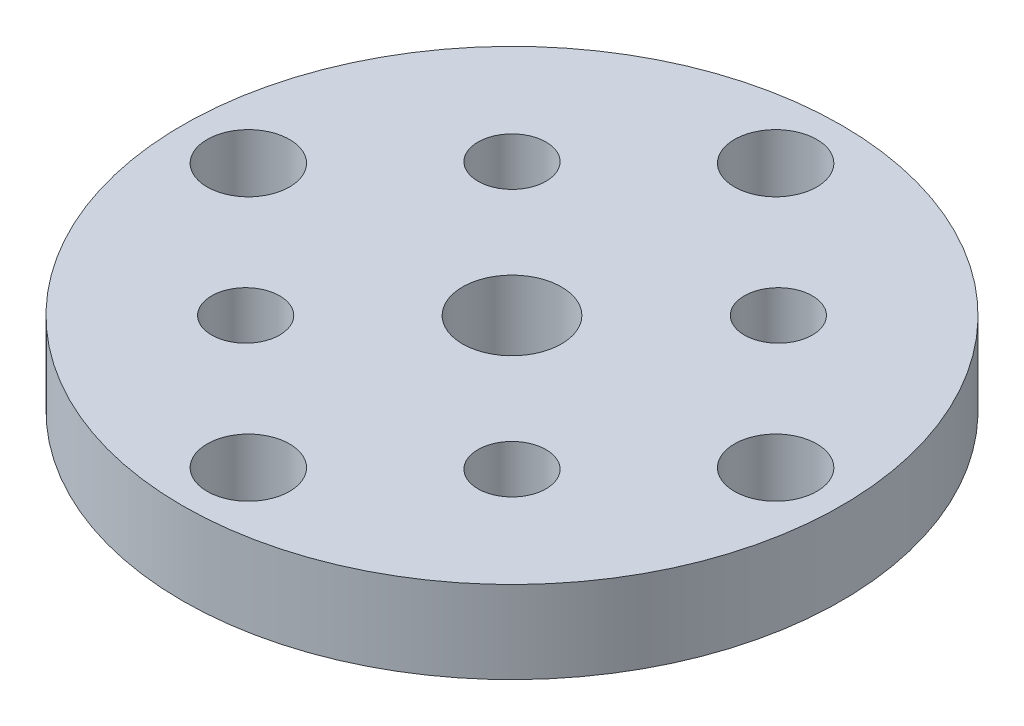
ISO-10303-21;
HEADER;
FILE_DESCRIPTION(('STEP AP214'),'2;1');
FILE_NAME('part.step','',(''),(''),'','','');
FILE_SCHEMA(('AUTOMOTIVE_DESIGN { 1 0 10303 214 1 1 1 1 }'));
ENDSEC;
DATA;
#1=APPLICATION_CONTEXT('core data for automotive mechanical design processes');
#2=APPLICATION_PROTOCOL_DEFINITION('international standard','automotive_design',2000,#1);
#3=PRODUCT_CONTEXT('',#1,'mechanical');
#4=PRODUCT('Part','Part','',(#3));
#5=PRODUCT_RELATED_PRODUCT_CATEGORY('part','',(#4));
#6=PRODUCT_DEFINITION_FORMATION('','',#4);
#7=PRODUCT_DEFINITION_CONTEXT('part definition',#1,'design');
#8=PRODUCT_DEFINITION('design','',#6,#7);
#9=PRODUCT_DEFINITION_SHAPE('','',#8);
#10=(LENGTH_UNIT() NAMED_UNIT(*) SI_UNIT(.MILLI.,.METRE.));
#11=(NAMED_UNIT(*) PLANE_ANGLE_UNIT() SI_UNIT($,.RADIAN.));
#12=(NAMED_UNIT(*) SI_UNIT($,.STERADIAN.) SOLID_ANGLE_UNIT());
#13=UNCERTAINTY_MEASURE_WITH_UNIT(LENGTH_MEASURE(1.E-05),#10,'distance_accuracy_value','');
#14=(GEOMETRIC_REPRESENTATION_CONTEXT(3) GLOBAL_UNCERTAINTY_ASSIGNED_CONTEXT((#13)) GLOBAL_UNIT_ASSIGNED_CONTEXT((#10,
#11,#12)) REPRESENTATION_CONTEXT('',''));
#15=CARTESIAN_POINT('',(0.,0.,0.));
#16=DIRECTION('',(0.,0.,1.));
#17=DIRECTION('',(1.,0.,0.));
#18=AXIS2_PLACEMENT_3D('',#15,#16,#17);
#19=CARTESIAN_POINT('',(0.,2.5,0.));
#20=DIRECTION('',(0.,-1.,0.));
#21=DIRECTION('',(0.,0.,-1.));
#22=AXIS2_PLACEMENT_3D('',#19,#20,#21);
#23=CYLINDRICAL_SURFACE('',#22,1.5);
#24=CARTESIAN_POINT('',(0.,2.5,0.));
#25=DIRECTION('',(0.,1.,0.));
#26=DIRECTION('',(0.,0.,1.));
#27=AXIS2_PLACEMENT_3D('',#24,#25,#26);
#28=CIRCLE('',#27,1.5);
#29=CARTESIAN_POINT('',(0.,2.5,1.5));
#30=VERTEX_POINT('',#29);
#31=EDGE_CURVE('E46',#30,#30,#28,.T.);
#32=ORIENTED_EDGE('',*,*,#31,.T.);
#33=EDGE_LOOP('',(#32));
#34=FACE_BOUND('',#33,.T.);
#35=CARTESIAN_POINT('',(0.,0.,0.));
#36=DIRECTION('',(0.,1.,0.));
#37=DIRECTION('',(0.,0.,1.));
#38=AXIS2_PLACEMENT_3D('',#35,#36,#37);
#39=CIRCLE('',#38,1.5);
#40=CARTESIAN_POINT('',(0.,0.,1.5));
#41=VERTEX_POINT('',#40);
#42=EDGE_CURVE('E67',#41,#41,#39,.T.);
#43=ORIENTED_EDGE('',*,*,#42,.F.);
#44=EDGE_LOOP('',(#43));
#45=FACE_BOUND('',#44,.T.);
#46=ADVANCED_FACE('F38',(#34,#45),#23,.F.);
#47=CARTESIAN_POINT('',(0.,2.5,-8.));
#48=DIRECTION('',(0.,-1.,0.));
#49=DIRECTION('',(0.,0.,-1.));
#50=AXIS2_PLACEMENT_3D('',#47,#48,#49);
#51=CYLINDRICAL_SURFACE('',#50,1.25);
#52=CARTESIAN_POINT('',(0.,2.5,-8.));
#53=DIRECTION('',(0.,1.,0.));
#54=DIRECTION('',(0.,0.,1.));
#55=AXIS2_PLACEMENT_3D('',#52,#53,#54);
#56=CIRCLE('',#55,1.25);
#57=CARTESIAN_POINT('',(0.,2.5,-6.75));
#58=VERTEX_POINT('',#57);
#59=EDGE_CURVE('E51',#58,#58,#56,.T.);
#60=ORIENTED_EDGE('',*,*,#59,.T.);
#61=EDGE_LOOP('',(#60));
#62=FACE_BOUND('',#61,.T.);
#63=CARTESIAN_POINT('',(0.,0.,-8.));
#64=DIRECTION('',(0.,1.,0.));
#65=DIRECTION('',(0.,0.,1.));
#66=AXIS2_PLACEMENT_3D('',#63,#64,#65);
#67=CIRCLE('',#66,1.25);
#68=CARTESIAN_POINT('',(0.,0.,-6.75));
#69=VERTEX_POINT('',#68);
#70=EDGE_CURVE('E65',#69,#69,#67,.T.);
#71=ORIENTED_EDGE('',*,*,#70,.F.);
#72=EDGE_LOOP('',(#71));
#73=FACE_BOUND('',#72,.T.);
#74=ADVANCED_FACE('F91',(#62,#73),#51,.F.);
#75=CARTESIAN_POINT('',(8.,2.5,0.));
#76=DIRECTION('',(0.,-1.,0.));
#77=DIRECTION('',(0.,0.,-1.));
#78=AXIS2_PLACEMENT_3D('',#75,#76,#77);
#79=CYLINDRICAL_SURFACE('',#78,1.25);
#80=CARTESIAN_POINT('',(8.,2.5,0.));
#81=DIRECTION('',(0.,1.,0.));
#82=DIRECTION('',(0.,0.,1.));
#83=AXIS2_PLACEMENT_3D('',#80,#81,#82);
#84=CIRCLE('',#83,1.25);
#85=CARTESIAN_POINT('',(8.,2.5,1.25));
#86=VERTEX_POINT('',#85);
#87=EDGE_CURVE('E81',#86,#86,#84,.T.);
#88=ORIENTED_EDGE('',*,*,#87,.T.);
#89=EDGE_LOOP('',(#88));
#90=FACE_BOUND('',#89,.T.);
#91=CARTESIAN_POINT('',(8.,0.,0.));
#92=DIRECTION('',(0.,1.,0.));
#93=DIRECTION('',(0.,0.,1.));
#94=AXIS2_PLACEMENT_3D('',#91,#92,#93);
#95=CIRCLE('',#94,1.25);
#96=CARTESIAN_POINT('',(8.,0.,1.25));
#97=VERTEX_POINT('',#96);
#98=EDGE_CURVE('E62',#97,#97,#95,.T.);
#99=ORIENTED_EDGE('',*,*,#98,.F.);
#100=EDGE_LOOP('',(#99));
#101=FACE_BOUND('',#100,.T.);
#102=ADVANCED_FACE('F109',(#90,#101),#79,.F.);
#103=CARTESIAN_POINT('',(0.,2.5,8.));
#104=DIRECTION('',(0.,-1.,0.));
#105=DIRECTION('',(0.,0.,-1.));
#106=AXIS2_PLACEMENT_3D('',#103,#104,#105);
#107=CYLINDRICAL_SURFACE('',#106,1.25);
#108=CARTESIAN_POINT('',(0.,2.5,8.));
#109=DIRECTION('',(0.,1.,0.));
#110=DIRECTION('',(0.,0.,1.));
#111=AXIS2_PLACEMENT_3D('',#108,#109,#110);
#112=CIRCLE('',#111,1.25);
#113=CARTESIAN_POINT('',(0.,2.5,9.25));
#114=VERTEX_POINT('',#113);
#115=EDGE_CURVE('E76',#114,#114,#112,.T.);
#116=ORIENTED_EDGE('',*,*,#115,.T.);
#117=EDGE_LOOP('',(#116));
#118=FACE_BOUND('',#117,.T.);
#119=CARTESIAN_POINT('',(0.,0.,8.));
#120=DIRECTION('',(0.,1.,0.));
#121=DIRECTION('',(0.,0.,1.));
#122=AXIS2_PLACEMENT_3D('',#119,#120,#121);
#123=CIRCLE('',#122,1.25);
#124=CARTESIAN_POINT('',(0.,0.,9.25));
#125=VERTEX_POINT('',#124);
#126=EDGE_CURVE('E58',#125,#125,#123,.T.);
#127=ORIENTED_EDGE('',*,*,#126,.F.);
#128=EDGE_LOOP('',(#127));
#129=FACE_BOUND('',#128,.T.);
#130=ADVANCED_FACE('F115',(#118,#129),#107,.F.);
#131=CARTESIAN_POINT('',(-8.,2.5,0.));
#132=DIRECTION('',(0.,-1.,0.));
#133=DIRECTION('',(0.,0.,-1.));
#134=AXIS2_PLACEMENT_3D('',#131,#132,#133);
#135=CYLINDRICAL_SURFACE('',#134,1.25);
#136=CARTESIAN_POINT('',(-8.,2.5,0.));
#137=DIRECTION('',(0.,1.,0.));
#138=DIRECTION('',(0.,0.,1.));
#139=AXIS2_PLACEMENT_3D('',#136,#137,#138);
#140=CIRCLE('',#139,1.25);
#141=CARTESIAN_POINT('',(-8.,2.5,1.25));
#142=VERTEX_POINT('',#141);
#143=EDGE_CURVE('E72',#142,#142,#140,.T.);
#144=ORIENTED_EDGE('',*,*,#143,.T.);
#145=EDGE_LOOP('',(#144));
#146=FACE_BOUND('',#145,.T.);
#147=CARTESIAN_POINT('',(-8.,0.,0.));
#148=DIRECTION('',(0.,1.,0.));
#149=DIRECTION('',(0.,0.,1.));
#150=AXIS2_PLACEMENT_3D('',#147,#148,#149);
#151=CIRCLE('',#150,1.25);
#152=CARTESIAN_POINT('',(-8.,0.,1.25));
#153=VERTEX_POINT('',#152);
#154=EDGE_CURVE('E55',#153,#153,#151,.T.);
#155=ORIENTED_EDGE('',*,*,#154,.F.);
#156=EDGE_LOOP('',(#155));
#157=FACE_BOUND('',#156,.T.);
#158=ADVANCED_FACE('F40',(#146,#157),#135,.F.);
#159=CARTESIAN_POINT('',(0.,2.5,0.));
#160=DIRECTION('',(0.,-1.,0.));
#161=DIRECTION('',(0.,0.,-1.));
#162=AXIS2_PLACEMENT_3D('',#159,#160,#161);
#163=CYLINDRICAL_SURFACE('',#162,10.);
#164=CARTESIAN_POINT('',(0.,2.5,0.));
#165=DIRECTION('',(0.,1.,0.));
#166=DIRECTION('',(0.,0.,1.));
#167=AXIS2_PLACEMENT_3D('',#164,#165,#166);
#168=CIRCLE('',#167,10.);
#169=CARTESIAN_POINT('',(0.,2.5,10.));
#170=VERTEX_POINT('',#169);
#171=EDGE_CURVE('E10',#170,#170,#168,.T.);
#172=ORIENTED_EDGE('',*,*,#171,.F.);
#173=EDGE_LOOP('',(#172));
#174=FACE_BOUND('',#173,.T.);
#175=CARTESIAN_POINT('',(0.,0.,0.));
#176=DIRECTION('',(0.,1.,0.));
#177=DIRECTION('',(0.,0.,1.));
#178=AXIS2_PLACEMENT_3D('',#175,#176,#177);
#179=CIRCLE('',#178,10.);
#180=CARTESIAN_POINT('',(0.,0.,10.));
#181=VERTEX_POINT('',#180);
#182=EDGE_CURVE('E42',#181,#181,#179,.T.);
#183=ORIENTED_EDGE('',*,*,#182,.T.);
#184=EDGE_LOOP('',(#183));
#185=FACE_BOUND('',#184,.T.);
#186=ADVANCED_FACE('F98',(#174,#185),#163,.T.);
#187=CARTESIAN_POINT('',(0.,2.5,0.));
#188=DIRECTION('',(0.,1.,0.));
#189=DIRECTION('',(0.,0.,1.));
#190=AXIS2_PLACEMENT_3D('',#187,#188,#189);
#191=PLANE('',#190);
#192=CARTESIAN_POINT('',(-4.04111525448111,2.5,4.04111525448113));
#193=DIRECTION('',(0.,1.,0.));
#194=DIRECTION('',(0.,0.,1.));
#195=AXIS2_PLACEMENT_3D('',#192,#193,#194);
#196=CIRCLE('',#195,1.03251);
#197=CARTESIAN_POINT('',(-4.04111525448111,2.5,5.07362525448113));
#198=VERTEX_POINT('',#197);
#199=EDGE_CURVE('E175',#198,#198,#196,.T.);
#200=ORIENTED_EDGE('',*,*,#199,.F.);
#201=EDGE_LOOP('',(#200));
#202=FACE_BOUND('',#201,.T.);
#203=CARTESIAN_POINT('',(4.04111525448113,2.5,4.04111525448111));
#204=DIRECTION('',(0.,1.,0.));
#205=DIRECTION('',(0.,0.,1.));
#206=AXIS2_PLACEMENT_3D('',#203,#204,#205);
#207=CIRCLE('',#206,1.03251);
#208=CARTESIAN_POINT('',(4.04111525448113,2.5,5.07362525448111));
#209=VERTEX_POINT('',#208);
#210=EDGE_CURVE('E168',#209,#209,#207,.T.);
#211=ORIENTED_EDGE('',*,*,#210,.F.);
#212=EDGE_LOOP('',(#211));
#213=FACE_BOUND('',#212,.T.);
#214=CARTESIAN_POINT('',(4.04111525448111,2.5,-4.04111525448113));
#215=DIRECTION('',(0.,1.,0.));
#216=DIRECTION('',(0.,0.,1.));
#217=AXIS2_PLACEMENT_3D('',#214,#215,#216);
#218=CIRCLE('',#217,1.03251);
#219=CARTESIAN_POINT('',(4.04111525448111,2.5,-3.00860525448113));
#220=VERTEX_POINT('',#219);
#221=EDGE_CURVE('E162',#220,#220,#218,.T.);
#222=ORIENTED_EDGE('',*,*,#221,.F.);
#223=EDGE_LOOP('',(#222));
#224=FACE_BOUND('',#223,.T.);
#225=CARTESIAN_POINT('',(-4.04111525448113,2.5,-4.04111525448111));
#226=DIRECTION('',(0.,1.,0.));
#227=DIRECTION('',(0.,0.,1.));
#228=AXIS2_PLACEMENT_3D('',#225,#226,#227);
#229=CIRCLE('',#228,1.03251);
#230=CARTESIAN_POINT('',(-4.04111525448113,2.5,-3.00860525448111));
#231=VERTEX_POINT('',#230);
#232=EDGE_CURVE('E84',#231,#231,#229,.T.);
#233=ORIENTED_EDGE('',*,*,#232,.F.);
#234=EDGE_LOOP('',(#233));
#235=FACE_BOUND('',#234,.T.);
#236=ORIENTED_EDGE('',*,*,#143,.F.);
#237=EDGE_LOOP('',(#236));
#238=FACE_BOUND('',#237,.T.);
#239=ORIENTED_EDGE('',*,*,#115,.F.);
#240=EDGE_LOOP('',(#239));
#241=FACE_BOUND('',#240,.T.);
#242=ORIENTED_EDGE('',*,*,#87,.F.);
#243=EDGE_LOOP('',(#242));
#244=FACE_BOUND('',#243,.T.);
#245=ORIENTED_EDGE('',*,*,#59,.F.);
#246=EDGE_LOOP('',(#245));
#247=FACE_BOUND('',#246,.T.);
#248=ORIENTED_EDGE('',*,*,#31,.F.);
#249=EDGE_LOOP('',(#248));
#250=FACE_BOUND('',#249,.T.);
#251=ORIENTED_EDGE('',*,*,#171,.T.);
#252=EDGE_LOOP('',(#251));
#253=FACE_BOUND('',#252,.T.);
#254=ADVANCED_FACE('F94',(#202,#213,#224,#235,#238,#241,#244,#247,#250,#253),#191,.T.);
#255=CARTESIAN_POINT('',(0.,0.,0.));
#256=DIRECTION('',(0.,1.,0.));
#257=DIRECTION('',(0.,0.,1.));
#258=AXIS2_PLACEMENT_3D('',#255,#256,#257);
#259=PLANE('',#258);
#260=CARTESIAN_POINT('',(-4.04111525448111,0.,4.04111525448113));
#261=DIRECTION('',(0.,1.,0.));
#262=DIRECTION('',(0.,0.,1.));
#263=AXIS2_PLACEMENT_3D('',#260,#261,#262);
#264=CIRCLE('',#263,1.03251);
#265=CARTESIAN_POINT('',(-4.04111525448111,0.,5.07362525448113));
#266=VERTEX_POINT('',#265);
#267=EDGE_CURVE('E173',#266,#266,#264,.T.);
#268=ORIENTED_EDGE('',*,*,#267,.T.);
#269=EDGE_LOOP('',(#268));
#270=FACE_BOUND('',#269,.T.);
#271=CARTESIAN_POINT('',(4.04111525448113,0.,4.04111525448111));
#272=DIRECTION('',(0.,1.,0.));
#273=DIRECTION('',(0.,0.,1.));
#274=AXIS2_PLACEMENT_3D('',#271,#272,#273);
#275=CIRCLE('',#274,1.03251);
#276=CARTESIAN_POINT('',(4.04111525448113,0.,5.07362525448111));
#277=VERTEX_POINT('',#276);
#278=EDGE_CURVE('E164',#277,#277,#275,.T.);
#279=ORIENTED_EDGE('',*,*,#278,.T.);
#280=EDGE_LOOP('',(#279));
#281=FACE_BOUND('',#280,.T.);
#282=CARTESIAN_POINT('',(4.04111525448111,0.,-4.04111525448113));
#283=DIRECTION('',(0.,1.,0.));
#284=DIRECTION('',(0.,0.,1.));
#285=AXIS2_PLACEMENT_3D('',#282,#283,#284);
#286=CIRCLE('',#285,1.03251);
#287=CARTESIAN_POINT('',(4.04111525448111,0.,-3.00860525448113));
#288=VERTEX_POINT('',#287);
#289=EDGE_CURVE('E159',#288,#288,#286,.T.);
#290=ORIENTED_EDGE('',*,*,#289,.T.);
#291=EDGE_LOOP('',(#290));
#292=FACE_BOUND('',#291,.T.);
#293=CARTESIAN_POINT('',(-4.04111525448113,0.,-4.04111525448111));
#294=DIRECTION('',(0.,1.,0.));
#295=DIRECTION('',(0.,0.,1.));
#296=AXIS2_PLACEMENT_3D('',#293,#294,#295);
#297=CIRCLE('',#296,1.03251);
#298=CARTESIAN_POINT('',(-4.04111525448113,0.,-3.00860525448111));
#299=VERTEX_POINT('',#298);
#300=EDGE_CURVE('E59',#299,#299,#297,.T.);
#301=ORIENTED_EDGE('',*,*,#300,.T.);
#302=EDGE_LOOP('',(#301));
#303=FACE_BOUND('',#302,.T.);
#304=ORIENTED_EDGE('',*,*,#154,.T.);
#305=EDGE_LOOP('',(#304));
#306=FACE_BOUND('',#305,.T.);
#307=ORIENTED_EDGE('',*,*,#126,.T.);
#308=EDGE_LOOP('',(#307));
#309=FACE_BOUND('',#308,.T.);
#310=ORIENTED_EDGE('',*,*,#98,.T.);
#311=EDGE_LOOP('',(#310));
#312=FACE_BOUND('',#311,.T.);
#313=ORIENTED_EDGE('',*,*,#70,.T.);
#314=EDGE_LOOP('',(#313));
#315=FACE_BOUND('',#314,.T.);
#316=ORIENTED_EDGE('',*,*,#42,.T.);
#317=EDGE_LOOP('',(#316));
#318=FACE_BOUND('',#317,.T.);
#319=ORIENTED_EDGE('',*,*,#182,.F.);
#320=EDGE_LOOP('',(#319));
#321=FACE_BOUND('',#320,.T.);
#322=ADVANCED_FACE('F97',(#270,#281,#292,#303,#306,#309,#312,#315,#318,#321),#259,.F.);
#323=CARTESIAN_POINT('',(-4.04111525448113,0.,-4.04111525448111));
#324=DIRECTION('',(0.,1.,0.));
#325=DIRECTION('',(0.,0.,1.));
#326=AXIS2_PLACEMENT_3D('',#323,#324,#325);
#327=CYLINDRICAL_SURFACE('',#326,1.03251);
#328=ORIENTED_EDGE('',*,*,#300,.F.);
#329=EDGE_LOOP('',(#328));
#330=FACE_BOUND('',#329,.T.);
#331=ORIENTED_EDGE('',*,*,#232,.T.);
#332=EDGE_LOOP('',(#331));
#333=FACE_BOUND('',#332,.T.);
#334=ADVANCED_FACE('F128',(#330,#333),#327,.F.);
#335=CARTESIAN_POINT('',(4.04111525448111,0.,-4.04111525448113));
#336=DIRECTION('',(0.,1.,0.));
#337=DIRECTION('',(0.,0.,1.));
#338=AXIS2_PLACEMENT_3D('',#335,#336,#337);
#339=CYLINDRICAL_SURFACE('',#338,1.03251);
#340=ORIENTED_EDGE('',*,*,#289,.F.);
#341=EDGE_LOOP('',(#340));
#342=FACE_BOUND('',#341,.T.);
#343=ORIENTED_EDGE('',*,*,#221,.T.);
#344=EDGE_LOOP('',(#343));
#345=FACE_BOUND('',#344,.T.);
#346=ADVANCED_FACE('F138',(#342,#345),#339,.F.);
#347=CARTESIAN_POINT('',(4.04111525448113,0.,4.04111525448111));
#348=DIRECTION('',(0.,1.,0.));
#349=DIRECTION('',(0.,0.,1.));
#350=AXIS2_PLACEMENT_3D('',#347,#348,#349);
#351=CYLINDRICAL_SURFACE('',#350,1.03251);
#352=ORIENTED_EDGE('',*,*,#278,.F.);
#353=EDGE_LOOP('',(#352));
#354=FACE_BOUND('',#353,.T.);
#355=ORIENTED_EDGE('',*,*,#210,.T.);
#356=EDGE_LOOP('',(#355));
#357=FACE_BOUND('',#356,.T.);
#358=ADVANCED_FACE('F147',(#354,#357),#351,.F.);
#359=CARTESIAN_POINT('',(-4.04111525448111,0.,4.04111525448113));
#360=DIRECTION('',(0.,1.,0.));
#361=DIRECTION('',(0.,0.,1.));
#362=AXIS2_PLACEMENT_3D('',#359,#360,#361);
#363=CYLINDRICAL_SURFACE('',#362,1.03251);
#364=ORIENTED_EDGE('',*,*,#267,.F.);
#365=EDGE_LOOP('',(#364));
#366=FACE_BOUND('',#365,.T.);
#367=ORIENTED_EDGE('',*,*,#199,.T.);
#368=EDGE_LOOP('',(#367));
#369=FACE_BOUND('',#368,.T.);
#370=ADVANCED_FACE('F144',(#366,#369),#363,.F.);
#371=CLOSED_SHELL('',(#46,#74,#102,#130,#158,#186,#254,#322,#334,#346,#358,#370));
#372=MANIFOLD_SOLID_BREP('B2',#371);
#373=ADVANCED_BREP_SHAPE_REPRESENTATION('',(#18,#372),#14);
#374=SHAPE_DEFINITION_REPRESENTATION(#9,#373);
ENDSEC;
END-ISO-10303-21;
